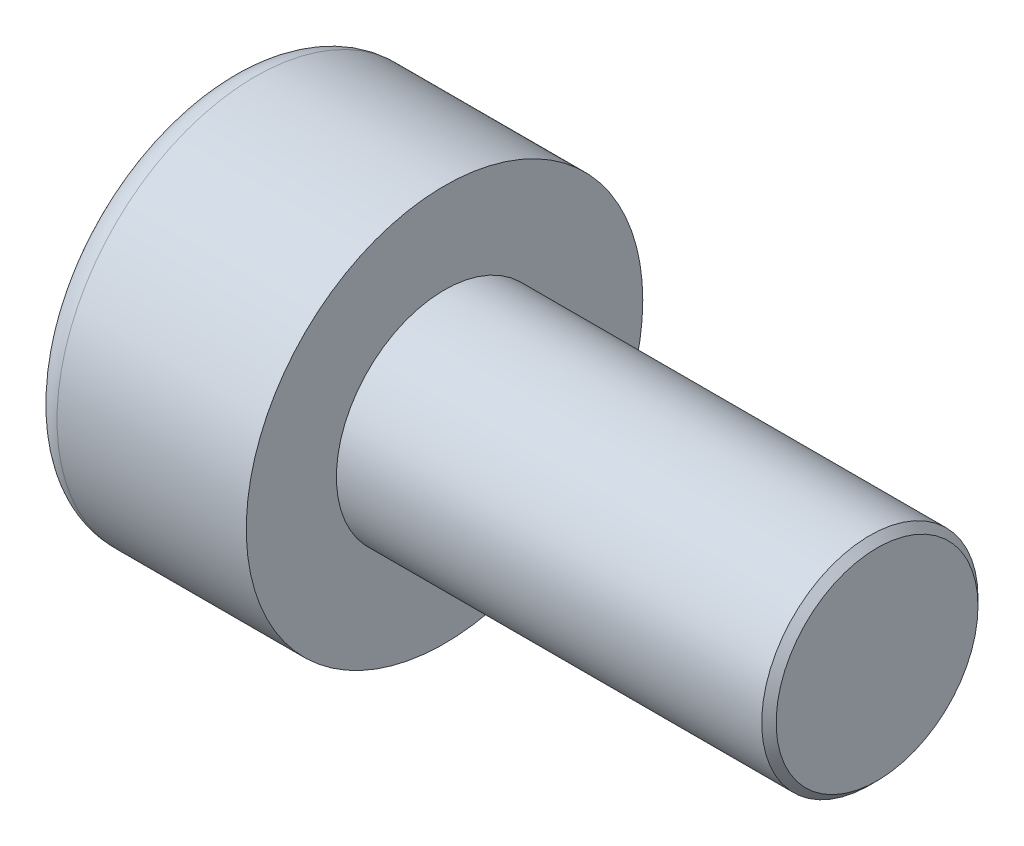
ISO-10303-21;
HEADER;
FILE_DESCRIPTION(('STEP AP214'),'2;1');
FILE_NAME('part.step','',(''),(''),'','','');
FILE_SCHEMA(('AUTOMOTIVE_DESIGN { 1 0 10303 214 1 1 1 1 }'));
ENDSEC;
DATA;
#1=APPLICATION_CONTEXT('core data for automotive mechanical design processes');
#2=APPLICATION_PROTOCOL_DEFINITION('international standard','automotive_design',2000,#1);
#3=PRODUCT_CONTEXT('',#1,'mechanical');
#4=PRODUCT('Part','Part','',(#3));
#5=PRODUCT_RELATED_PRODUCT_CATEGORY('part','',(#4));
#6=PRODUCT_DEFINITION_FORMATION('','',#4);
#7=PRODUCT_DEFINITION_CONTEXT('part definition',#1,'design');
#8=PRODUCT_DEFINITION('design','',#6,#7);
#9=PRODUCT_DEFINITION_SHAPE('','',#8);
#10=(LENGTH_UNIT() NAMED_UNIT(*) SI_UNIT(.MILLI.,.METRE.));
#11=(NAMED_UNIT(*) PLANE_ANGLE_UNIT() SI_UNIT($,.RADIAN.));
#12=(NAMED_UNIT(*) SI_UNIT($,.STERADIAN.) SOLID_ANGLE_UNIT());
#13=UNCERTAINTY_MEASURE_WITH_UNIT(LENGTH_MEASURE(1.E-05),#10,'distance_accuracy_value','');
#14=(GEOMETRIC_REPRESENTATION_CONTEXT(3) GLOBAL_UNCERTAINTY_ASSIGNED_CONTEXT((#13)) GLOBAL_UNIT_ASSIGNED_CONTEXT((#10,
#11,#12)) REPRESENTATION_CONTEXT('',''));
#15=CARTESIAN_POINT('',(0.,0.,0.));
#16=DIRECTION('',(0.,0.,1.));
#17=DIRECTION('',(1.,0.,0.));
#18=AXIS2_PLACEMENT_3D('',#15,#16,#17);
#19=CARTESIAN_POINT('',(1.3,0.,-1.44337567297406));
#20=DIRECTION('',(1.,0.,0.));
#21=DIRECTION('',(0.,0.,-1.));
#22=AXIS2_PLACEMENT_3D('',#19,#20,#21);
#23=PLANE('',#22);
#24=DIRECTION('',(0.,0.866025403784438,0.5));
#25=VECTOR('',#24,1.);
#26=CARTESIAN_POINT('',(1.3,0.,-1.44337567297406));
#27=LINE('',#26,#25);
#28=CARTESIAN_POINT('',(1.3,0.625,-1.08253175473055));
#29=VERTEX_POINT('',#28);
#30=CARTESIAN_POINT('',(1.3,1.25,-0.721687836487031));
#31=VERTEX_POINT('',#30);
#32=EDGE_CURVE('E368',#29,#31,#27,.T.);
#33=ORIENTED_EDGE('',*,*,#32,.F.);
#34=CARTESIAN_POINT('',(1.3,0.,0.));
#35=DIRECTION('',(1.,0.,0.));
#36=DIRECTION('',(0.,0.,-1.));
#37=AXIS2_PLACEMENT_3D('',#34,#35,#36);
#38=CIRCLE('',#37,1.25);
#39=CARTESIAN_POINT('',(1.3,1.25,0.));
#40=VERTEX_POINT('',#39);
#41=EDGE_CURVE('E53',#29,#40,#38,.T.);
#42=ORIENTED_EDGE('',*,*,#41,.T.);
#43=DIRECTION('',(0.,0.,1.));
#44=VECTOR('',#43,1.);
#45=CARTESIAN_POINT('',(1.3,1.25,-0.721687836487031));
#46=LINE('',#45,#44);
#47=EDGE_CURVE('E374',#31,#40,#46,.T.);
#48=ORIENTED_EDGE('',*,*,#47,.F.);
#49=EDGE_LOOP('',(#33,#42,#48));
#50=FACE_BOUND('',#49,.T.);
#51=ADVANCED_FACE('F38',(#50),#23,.F.);
#52=CARTESIAN_POINT('',(1.3,1.25,0.721687836487033));
#53=VERTEX_POINT('',#52);
#54=EDGE_CURVE('E373',#40,#53,#46,.T.);
#55=ORIENTED_EDGE('',*,*,#54,.F.);
#56=CARTESIAN_POINT('',(1.3,0.625,1.08253175473055));
#57=VERTEX_POINT('',#56);
#58=EDGE_CURVE('E201',#40,#57,#38,.T.);
#59=ORIENTED_EDGE('',*,*,#58,.T.);
#60=DIRECTION('',(0.,-0.866025403784439,0.5));
#61=VECTOR('',#60,1.);
#62=CARTESIAN_POINT('',(1.3,1.25,0.721687836487033));
#63=LINE('',#62,#61);
#64=EDGE_CURVE('E377',#53,#57,#63,.T.);
#65=ORIENTED_EDGE('',*,*,#64,.F.);
#66=EDGE_LOOP('',(#55,#59,#65));
#67=FACE_BOUND('',#66,.T.);
#68=ADVANCED_FACE('F127',(#67),#23,.F.);
#69=CARTESIAN_POINT('',(1.3,0.,1.44337567297407));
#70=VERTEX_POINT('',#69);
#71=EDGE_CURVE('E376',#57,#70,#63,.T.);
#72=ORIENTED_EDGE('',*,*,#71,.F.);
#73=CARTESIAN_POINT('',(1.3,-0.625,1.08253175473055));
#74=VERTEX_POINT('',#73);
#75=EDGE_CURVE('E388',#57,#74,#38,.T.);
#76=ORIENTED_EDGE('',*,*,#75,.T.);
#77=DIRECTION('',(0.,-0.866025403784439,-0.5));
#78=VECTOR('',#77,1.);
#79=CARTESIAN_POINT('',(1.3,0.,1.44337567297407));
#80=LINE('',#79,#78);
#81=EDGE_CURVE('E327',#70,#74,#80,.T.);
#82=ORIENTED_EDGE('',*,*,#81,.F.);
#83=EDGE_LOOP('',(#72,#76,#82));
#84=FACE_BOUND('',#83,.T.);
#85=ADVANCED_FACE('F132',(#84),#23,.F.);
#86=CARTESIAN_POINT('',(1.3,-1.25,0.721687836487033));
#87=VERTEX_POINT('',#86);
#88=EDGE_CURVE('E379',#74,#87,#80,.T.);
#89=ORIENTED_EDGE('',*,*,#88,.F.);
#90=CARTESIAN_POINT('',(1.3,-1.25,0.));
#91=VERTEX_POINT('',#90);
#92=EDGE_CURVE('E390',#74,#91,#38,.T.);
#93=ORIENTED_EDGE('',*,*,#92,.T.);
#94=DIRECTION('',(0.,0.,-1.));
#95=VECTOR('',#94,1.);
#96=CARTESIAN_POINT('',(1.3,-1.25,0.721687836487033));
#97=LINE('',#96,#95);
#98=EDGE_CURVE('E326',#87,#91,#97,.T.);
#99=ORIENTED_EDGE('',*,*,#98,.F.);
#100=EDGE_LOOP('',(#89,#93,#99));
#101=FACE_BOUND('',#100,.T.);
#102=ADVANCED_FACE('F303',(#101),#23,.F.);
#103=CARTESIAN_POINT('',(1.3,-1.25,-0.721687836487032));
#104=VERTEX_POINT('',#103);
#105=EDGE_CURVE('E321',#91,#104,#97,.T.);
#106=ORIENTED_EDGE('',*,*,#105,.F.);
#107=CARTESIAN_POINT('',(1.3,-0.625,-1.08253175473055));
#108=VERTEX_POINT('',#107);
#109=EDGE_CURVE('E192',#91,#108,#38,.T.);
#110=ORIENTED_EDGE('',*,*,#109,.T.);
#111=DIRECTION('',(0.,0.866025403784439,-0.5));
#112=VECTOR('',#111,1.);
#113=CARTESIAN_POINT('',(1.3,-1.25,-0.721687836487032));
#114=LINE('',#113,#112);
#115=EDGE_CURVE('E325',#104,#108,#114,.T.);
#116=ORIENTED_EDGE('',*,*,#115,.F.);
#117=EDGE_LOOP('',(#106,#110,#116));
#118=FACE_BOUND('',#117,.T.);
#119=ADVANCED_FACE('F125',(#118),#23,.F.);
#120=CARTESIAN_POINT('',(0.,0.,0.));
#121=DIRECTION('',(1.,0.,0.));
#122=DIRECTION('',(0.,0.,-1.));
#123=AXIS2_PLACEMENT_3D('',#120,#121,#122);
#124=PLANE('',#123);
#125=CARTESIAN_POINT('',(0.,0.,0.));
#126=DIRECTION('',(1.,0.,0.));
#127=DIRECTION('',(0.,0.,-1.));
#128=AXIS2_PLACEMENT_3D('',#125,#126,#127);
#129=CIRCLE('',#128,2.375);
#130=CARTESIAN_POINT('',(0.,0.,-2.375));
#131=VERTEX_POINT('',#130);
#132=EDGE_CURVE('E200',#131,#131,#129,.F.);
#133=ORIENTED_EDGE('',*,*,#132,.T.);
#134=EDGE_LOOP('',(#133));
#135=FACE_BOUND('',#134,.T.);
#136=DIRECTION('',(0.,0.866025403784439,-0.5));
#137=VECTOR('',#136,1.);
#138=CARTESIAN_POINT('',(0.,-1.25,-0.721687836487032));
#139=LINE('',#138,#137);
#140=CARTESIAN_POINT('',(0.,-1.25,-0.721687836487032));
#141=VERTEX_POINT('',#140);
#142=CARTESIAN_POINT('',(0.,0.,-1.44337567297406));
#143=VERTEX_POINT('',#142);
#144=EDGE_CURVE('E61',#141,#143,#139,.T.);
#145=ORIENTED_EDGE('',*,*,#144,.T.);
#146=DIRECTION('',(0.,0.866025403784438,0.5));
#147=VECTOR('',#146,1.);
#148=CARTESIAN_POINT('',(0.,0.,-1.44337567297406));
#149=LINE('',#148,#147);
#150=CARTESIAN_POINT('',(0.,1.25,-0.721687836487031));
#151=VERTEX_POINT('',#150);
#152=EDGE_CURVE('E341',#143,#151,#149,.T.);
#153=ORIENTED_EDGE('',*,*,#152,.T.);
#154=DIRECTION('',(0.,0.,1.));
#155=VECTOR('',#154,1.);
#156=CARTESIAN_POINT('',(0.,1.25,-0.721687836487031));
#157=LINE('',#156,#155);
#158=CARTESIAN_POINT('',(0.,1.25,0.721687836487033));
#159=VERTEX_POINT('',#158);
#160=EDGE_CURVE('E344',#151,#159,#157,.T.);
#161=ORIENTED_EDGE('',*,*,#160,.T.);
#162=DIRECTION('',(0.,-0.866025403784439,0.5));
#163=VECTOR('',#162,1.);
#164=CARTESIAN_POINT('',(0.,1.25,0.721687836487033));
#165=LINE('',#164,#163);
#166=CARTESIAN_POINT('',(0.,0.,1.44337567297407));
#167=VERTEX_POINT('',#166);
#168=EDGE_CURVE('E347',#159,#167,#165,.T.);
#169=ORIENTED_EDGE('',*,*,#168,.T.);
#170=DIRECTION('',(0.,-0.866025403784439,-0.5));
#171=VECTOR('',#170,1.);
#172=CARTESIAN_POINT('',(0.,0.,1.44337567297407));
#173=LINE('',#172,#171);
#174=CARTESIAN_POINT('',(0.,-1.25,0.721687836487033));
#175=VERTEX_POINT('',#174);
#176=EDGE_CURVE('E350',#167,#175,#173,.T.);
#177=ORIENTED_EDGE('',*,*,#176,.T.);
#178=DIRECTION('',(0.,0.,-1.));
#179=VECTOR('',#178,1.);
#180=CARTESIAN_POINT('',(0.,-1.25,0.721687836487033));
#181=LINE('',#180,#179);
#182=EDGE_CURVE('E353',#175,#141,#181,.T.);
#183=ORIENTED_EDGE('',*,*,#182,.T.);
#184=EDGE_LOOP('',(#145,#153,#161,#169,#177,#183));
#185=FACE_BOUND('',#184,.T.);
#186=ADVANCED_FACE('F170',(#135,#185),#124,.F.);
#187=CARTESIAN_POINT('',(3.,0.,0.));
#188=DIRECTION('',(1.,0.,0.));
#189=DIRECTION('',(0.,0.,-1.));
#190=AXIS2_PLACEMENT_3D('',#187,#188,#189);
#191=PLANE('',#190);
#192=CARTESIAN_POINT('',(3.,0.,0.));
#193=DIRECTION('',(1.,0.,0.));
#194=DIRECTION('',(0.,0.,-1.));
#195=AXIS2_PLACEMENT_3D('',#192,#193,#194);
#196=CIRCLE('',#195,2.75);
#197=CARTESIAN_POINT('',(3.,0.,-2.75));
#198=VERTEX_POINT('',#197);
#199=EDGE_CURVE('E185',#198,#198,#196,.T.);
#200=ORIENTED_EDGE('',*,*,#199,.T.);
#201=EDGE_LOOP('',(#200));
#202=FACE_BOUND('',#201,.T.);
#203=CARTESIAN_POINT('',(3.,0.,0.));
#204=DIRECTION('',(1.,0.,0.));
#205=DIRECTION('',(0.,0.,-1.));
#206=AXIS2_PLACEMENT_3D('',#203,#204,#205);
#207=CIRCLE('',#206,1.5);
#208=CARTESIAN_POINT('',(3.,0.,-1.5));
#209=VERTEX_POINT('',#208);
#210=EDGE_CURVE('E188',#209,#209,#207,.T.);
#211=ORIENTED_EDGE('',*,*,#210,.F.);
#212=EDGE_LOOP('',(#211));
#213=FACE_BOUND('',#212,.T.);
#214=ADVANCED_FACE('F167',(#202,#213),#191,.T.);
#215=CARTESIAN_POINT('',(3.,0.,0.));
#216=DIRECTION('',(-1.,0.,0.));
#217=DIRECTION('',(0.,0.,1.));
#218=AXIS2_PLACEMENT_3D('',#215,#216,#217);
#219=CYLINDRICAL_SURFACE('',#218,2.75);
#220=CARTESIAN_POINT('',(0.375,0.,0.));
#221=DIRECTION('',(1.,0.,0.));
#222=DIRECTION('',(0.,0.,-1.));
#223=AXIS2_PLACEMENT_3D('',#220,#221,#222);
#224=CIRCLE('',#223,2.75);
#225=CARTESIAN_POINT('',(0.375,0.,-2.75));
#226=VERTEX_POINT('',#225);
#227=EDGE_CURVE('E182',#226,#226,#224,.T.);
#228=ORIENTED_EDGE('',*,*,#227,.T.);
#229=EDGE_LOOP('',(#228));
#230=FACE_BOUND('',#229,.T.);
#231=ORIENTED_EDGE('',*,*,#199,.F.);
#232=EDGE_LOOP('',(#231));
#233=FACE_BOUND('',#232,.T.);
#234=ADVANCED_FACE('F165',(#230,#233),#219,.T.);
#235=CARTESIAN_POINT('',(9.,0.,0.));
#236=DIRECTION('',(-1.,0.,0.));
#237=DIRECTION('',(0.,0.,1.));
#238=AXIS2_PLACEMENT_3D('',#235,#236,#237);
#239=CYLINDRICAL_SURFACE('',#238,1.5);
#240=CARTESIAN_POINT('',(8.9,0.,0.));
#241=DIRECTION('',(1.,0.,0.));
#242=DIRECTION('',(0.,0.,-1.));
#243=AXIS2_PLACEMENT_3D('',#240,#241,#242);
#244=CIRCLE('',#243,1.5);
#245=CARTESIAN_POINT('',(8.9,0.,-1.5));
#246=VERTEX_POINT('',#245);
#247=EDGE_CURVE('E11',#246,#246,#244,.F.);
#248=ORIENTED_EDGE('',*,*,#247,.T.);
#249=EDGE_LOOP('',(#248));
#250=FACE_BOUND('',#249,.T.);
#251=ORIENTED_EDGE('',*,*,#210,.T.);
#252=EDGE_LOOP('',(#251));
#253=FACE_BOUND('',#252,.T.);
#254=ADVANCED_FACE('F161',(#250,#253),#239,.T.);
#255=CARTESIAN_POINT('',(9.,0.,0.));
#256=DIRECTION('',(1.,0.,0.));
#257=DIRECTION('',(0.,0.,-1.));
#258=AXIS2_PLACEMENT_3D('',#255,#256,#257);
#259=PLANE('',#258);
#260=CARTESIAN_POINT('',(9.,0.,0.));
#261=DIRECTION('',(1.,0.,0.));
#262=DIRECTION('',(0.,0.,-1.));
#263=AXIS2_PLACEMENT_3D('',#260,#261,#262);
#264=CIRCLE('',#263,1.4);
#265=CARTESIAN_POINT('',(9.,0.,-1.4));
#266=VERTEX_POINT('',#265);
#267=EDGE_CURVE('E46',#266,#266,#264,.T.);
#268=ORIENTED_EDGE('',*,*,#267,.T.);
#269=EDGE_LOOP('',(#268));
#270=FACE_BOUND('',#269,.T.);
#271=ADVANCED_FACE('F158',(#270),#259,.T.);
#272=CARTESIAN_POINT('',(1.3,-1.25,-0.721687836487032));
#273=DIRECTION('',(0.,0.5,0.866025403784439));
#274=DIRECTION('',(0.,-0.866025403784439,0.5));
#275=AXIS2_PLACEMENT_3D('',#272,#273,#274);
#276=PLANE('',#275);
#277=ORIENTED_EDGE('',*,*,#144,.F.);
#278=DIRECTION('',(-1.,0.,0.));
#279=VECTOR('',#278,1.);
#280=CARTESIAN_POINT('',(1.3,-1.25,-0.721687836487032));
#281=LINE('',#280,#279);
#282=EDGE_CURVE('E335',#104,#141,#281,.T.);
#283=ORIENTED_EDGE('',*,*,#282,.F.);
#284=ORIENTED_EDGE('',*,*,#115,.T.);
#285=CARTESIAN_POINT('',(1.3,0.,-1.44337567297406));
#286=VERTEX_POINT('',#285);
#287=EDGE_CURVE('E355',#108,#286,#114,.T.);
#288=ORIENTED_EDGE('',*,*,#287,.T.);
#289=DIRECTION('',(-1.,0.,0.));
#290=VECTOR('',#289,1.);
#291=CARTESIAN_POINT('',(1.3,0.,-1.44337567297406));
#292=LINE('',#291,#290);
#293=EDGE_CURVE('E195',#286,#143,#292,.T.);
#294=ORIENTED_EDGE('',*,*,#293,.T.);
#295=EDGE_LOOP('',(#277,#283,#284,#288,#294));
#296=FACE_BOUND('',#295,.T.);
#297=ADVANCED_FACE('F154',(#296),#276,.T.);
#298=CARTESIAN_POINT('',(1.3,0.,-1.44337567297406));
#299=DIRECTION('',(0.,-0.5,0.866025403784438));
#300=DIRECTION('',(0.,-0.866025403784438,-0.5));
#301=AXIS2_PLACEMENT_3D('',#298,#299,#300);
#302=PLANE('',#301);
#303=ORIENTED_EDGE('',*,*,#152,.F.);
#304=ORIENTED_EDGE('',*,*,#293,.F.);
#305=EDGE_CURVE('E370',#286,#29,#27,.T.);
#306=ORIENTED_EDGE('',*,*,#305,.T.);
#307=ORIENTED_EDGE('',*,*,#32,.T.);
#308=DIRECTION('',(-1.,0.,0.));
#309=VECTOR('',#308,1.);
#310=CARTESIAN_POINT('',(1.3,1.25,-0.721687836487031));
#311=LINE('',#310,#309);
#312=EDGE_CURVE('E362',#31,#151,#311,.T.);
#313=ORIENTED_EDGE('',*,*,#312,.T.);
#314=EDGE_LOOP('',(#303,#304,#306,#307,#313));
#315=FACE_BOUND('',#314,.T.);
#316=ADVANCED_FACE('F150',(#315),#302,.T.);
#317=CARTESIAN_POINT('',(1.3,1.25,-0.721687836487031));
#318=DIRECTION('',(0.,-1.,0.));
#319=DIRECTION('',(0.,0.,-1.));
#320=AXIS2_PLACEMENT_3D('',#317,#318,#319);
#321=PLANE('',#320);
#322=ORIENTED_EDGE('',*,*,#160,.F.);
#323=ORIENTED_EDGE('',*,*,#312,.F.);
#324=ORIENTED_EDGE('',*,*,#47,.T.);
#325=ORIENTED_EDGE('',*,*,#54,.T.);
#326=DIRECTION('',(-1.,0.,0.));
#327=VECTOR('',#326,1.);
#328=CARTESIAN_POINT('',(1.3,1.25,0.721687836487033));
#329=LINE('',#328,#327);
#330=EDGE_CURVE('E360',#53,#159,#329,.T.);
#331=ORIENTED_EDGE('',*,*,#330,.T.);
#332=EDGE_LOOP('',(#322,#323,#324,#325,#331));
#333=FACE_BOUND('',#332,.T.);
#334=ADVANCED_FACE('F146',(#333),#321,.T.);
#335=CARTESIAN_POINT('',(1.3,1.25,0.721687836487033));
#336=DIRECTION('',(0.,-0.5,-0.866025403784439));
#337=DIRECTION('',(0.,0.866025403784439,-0.5));
#338=AXIS2_PLACEMENT_3D('',#335,#336,#337);
#339=PLANE('',#338);
#340=ORIENTED_EDGE('',*,*,#168,.F.);
#341=ORIENTED_EDGE('',*,*,#330,.F.);
#342=ORIENTED_EDGE('',*,*,#64,.T.);
#343=ORIENTED_EDGE('',*,*,#71,.T.);
#344=DIRECTION('',(-1.,0.,0.));
#345=VECTOR('',#344,1.);
#346=CARTESIAN_POINT('',(1.3,0.,1.44337567297407));
#347=LINE('',#346,#345);
#348=EDGE_CURVE('E358',#70,#167,#347,.T.);
#349=ORIENTED_EDGE('',*,*,#348,.T.);
#350=EDGE_LOOP('',(#340,#341,#342,#343,#349));
#351=FACE_BOUND('',#350,.T.);
#352=ADVANCED_FACE('F142',(#351),#339,.T.);
#353=CARTESIAN_POINT('',(1.3,0.,1.44337567297407));
#354=DIRECTION('',(0.,0.5,-0.866025403784439));
#355=DIRECTION('',(0.,0.866025403784439,0.5));
#356=AXIS2_PLACEMENT_3D('',#353,#354,#355);
#357=PLANE('',#356);
#358=ORIENTED_EDGE('',*,*,#176,.F.);
#359=ORIENTED_EDGE('',*,*,#348,.F.);
#360=ORIENTED_EDGE('',*,*,#81,.T.);
#361=ORIENTED_EDGE('',*,*,#88,.T.);
#362=DIRECTION('',(-1.,0.,0.));
#363=VECTOR('',#362,1.);
#364=CARTESIAN_POINT('',(1.3,-1.25,0.721687836487033));
#365=LINE('',#364,#363);
#366=EDGE_CURVE('E332',#87,#175,#365,.T.);
#367=ORIENTED_EDGE('',*,*,#366,.T.);
#368=EDGE_LOOP('',(#358,#359,#360,#361,#367));
#369=FACE_BOUND('',#368,.T.);
#370=ADVANCED_FACE('F138',(#369),#357,.T.);
#371=CARTESIAN_POINT('',(1.3,-1.25,0.721687836487033));
#372=DIRECTION('',(0.,1.,0.));
#373=DIRECTION('',(0.,0.,1.));
#374=AXIS2_PLACEMENT_3D('',#371,#372,#373);
#375=PLANE('',#374);
#376=ORIENTED_EDGE('',*,*,#182,.F.);
#377=ORIENTED_EDGE('',*,*,#366,.F.);
#378=ORIENTED_EDGE('',*,*,#98,.T.);
#379=ORIENTED_EDGE('',*,*,#105,.T.);
#380=ORIENTED_EDGE('',*,*,#282,.T.);
#381=EDGE_LOOP('',(#376,#377,#378,#379,#380));
#382=FACE_BOUND('',#381,.T.);
#383=ADVANCED_FACE('F122',(#382),#375,.T.);
#384=ORIENTED_EDGE('',*,*,#287,.F.);
#385=EDGE_CURVE('E187',#108,#29,#38,.T.);
#386=ORIENTED_EDGE('',*,*,#385,.T.);
#387=ORIENTED_EDGE('',*,*,#305,.F.);
#388=EDGE_LOOP('',(#384,#386,#387));
#389=FACE_BOUND('',#388,.T.);
#390=ADVANCED_FACE('F115',(#389),#23,.F.);
#391=CARTESIAN_POINT('',(1.3,0.,0.));
#392=DIRECTION('',(-1.,0.,0.));
#393=DIRECTION('',(0.,0.,1.));
#394=AXIS2_PLACEMENT_3D('',#391,#392,#393);
#395=CONICAL_SURFACE('',#394,1.25,1.04719755119659);
#396=CARTESIAN_POINT('',(2.02168783648704,0.,0.));
#397=VERTEX_POINT('',#396);
#398=VERTEX_LOOP('',#397);
#399=FACE_BOUND('',#398,.T.);
#400=ORIENTED_EDGE('',*,*,#41,.F.);
#401=ORIENTED_EDGE('',*,*,#385,.F.);
#402=ORIENTED_EDGE('',*,*,#109,.F.);
#403=ORIENTED_EDGE('',*,*,#92,.F.);
#404=ORIENTED_EDGE('',*,*,#75,.F.);
#405=ORIENTED_EDGE('',*,*,#58,.F.);
#406=EDGE_LOOP('',(#400,#401,#402,#403,#404,#405));
#407=FACE_BOUND('',#406,.T.);
#408=ADVANCED_FACE('F112',(#399,#407),#395,.F.);
#409=CARTESIAN_POINT('',(0.375,0.,0.));
#410=DIRECTION('',(1.,0.,0.));
#411=DIRECTION('',(0.,0.,-1.));
#412=AXIS2_PLACEMENT_3D('',#409,#410,#411);
#413=TOROIDAL_SURFACE('',#412,2.375,0.375);
#414=ORIENTED_EDGE('',*,*,#132,.F.);
#415=EDGE_LOOP('',(#414));
#416=FACE_BOUND('',#415,.T.);
#417=ORIENTED_EDGE('',*,*,#227,.F.);
#418=EDGE_LOOP('',(#417));
#419=FACE_BOUND('',#418,.T.);
#420=ADVANCED_FACE('F114',(#416,#419),#413,.T.);
#421=CARTESIAN_POINT('',(9.,0.,0.));
#422=DIRECTION('',(-1.,0.,0.));
#423=DIRECTION('',(0.,0.,1.));
#424=AXIS2_PLACEMENT_3D('',#421,#422,#423);
#425=CONICAL_SURFACE('',#424,1.4,0.785398163397451);
#426=ORIENTED_EDGE('',*,*,#247,.F.);
#427=EDGE_LOOP('',(#426));
#428=FACE_BOUND('',#427,.T.);
#429=ORIENTED_EDGE('',*,*,#267,.F.);
#430=EDGE_LOOP('',(#429));
#431=FACE_BOUND('',#430,.T.);
#432=ADVANCED_FACE('F40',(#428,#431),#425,.T.);
#433=CLOSED_SHELL('',(#51,#68,#85,#102,#119,#186,#214,#234,#254,#271,#297,#316,#334,#352,#370,
#383,#390,#408,#420,#432));
#434=MANIFOLD_SOLID_BREP('B2',#433);
#435=ADVANCED_BREP_SHAPE_REPRESENTATION('',(#18,#434),#14);
#436=SHAPE_DEFINITION_REPRESENTATION(#9,#435);
ENDSEC;
END-ISO-10303-21;
